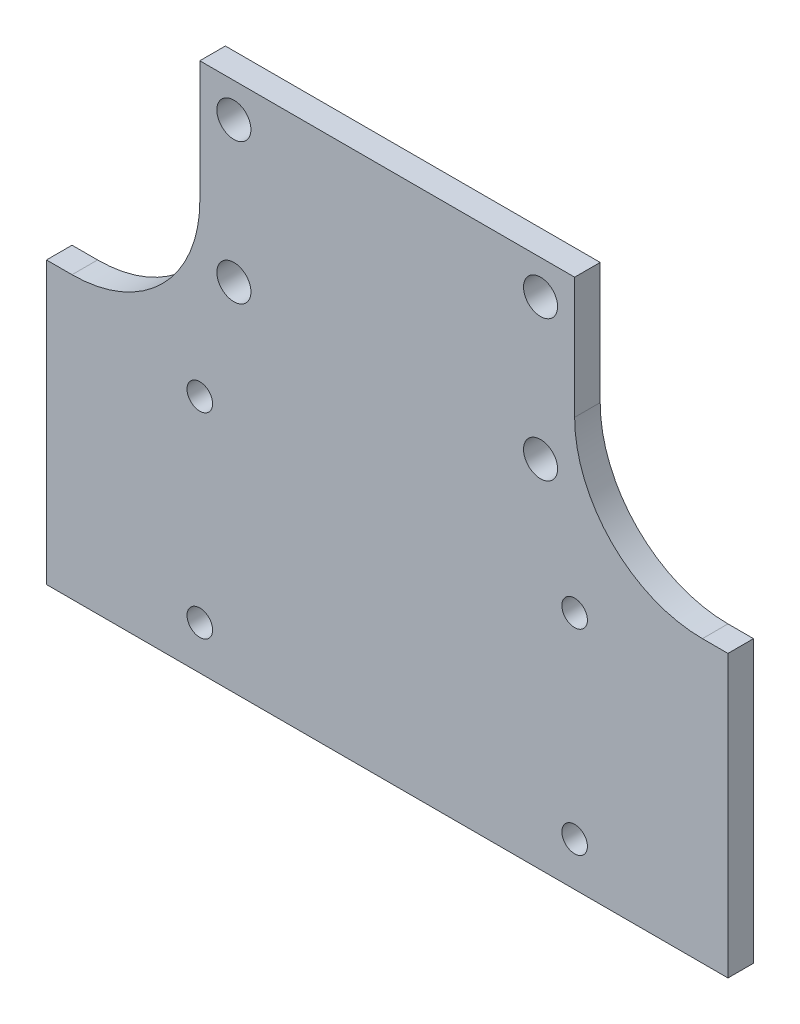
ISO-10303-21;
HEADER;
FILE_DESCRIPTION(('STEP AP214'),'2;1');
FILE_NAME('part.step','',(''),(''),'','','');
FILE_SCHEMA(('AUTOMOTIVE_DESIGN { 1 0 10303 214 1 1 1 1 }'));
ENDSEC;
DATA;
#1=APPLICATION_CONTEXT('core data for automotive mechanical design processes');
#2=APPLICATION_PROTOCOL_DEFINITION('international standard','automotive_design',2000,#1);
#3=PRODUCT_CONTEXT('',#1,'mechanical');
#4=PRODUCT('Part','Part','',(#3));
#5=PRODUCT_RELATED_PRODUCT_CATEGORY('part','',(#4));
#6=PRODUCT_DEFINITION_FORMATION('','',#4);
#7=PRODUCT_DEFINITION_CONTEXT('part definition',#1,'design');
#8=PRODUCT_DEFINITION('design','',#6,#7);
#9=PRODUCT_DEFINITION_SHAPE('','',#8);
#10=(LENGTH_UNIT() NAMED_UNIT(*) SI_UNIT(.MILLI.,.METRE.));
#11=(NAMED_UNIT(*) PLANE_ANGLE_UNIT() SI_UNIT($,.RADIAN.));
#12=(NAMED_UNIT(*) SI_UNIT($,.STERADIAN.) SOLID_ANGLE_UNIT());
#13=UNCERTAINTY_MEASURE_WITH_UNIT(LENGTH_MEASURE(1.E-05),#10,'distance_accuracy_value','');
#14=(GEOMETRIC_REPRESENTATION_CONTEXT(3) GLOBAL_UNCERTAINTY_ASSIGNED_CONTEXT((#13)) GLOBAL_UNIT_ASSIGNED_CONTEXT((#10,
#11,#12)) REPRESENTATION_CONTEXT('',''));
#15=CARTESIAN_POINT('',(0.,0.,0.));
#16=DIRECTION('',(0.,0.,1.));
#17=DIRECTION('',(1.,0.,0.));
#18=AXIS2_PLACEMENT_3D('',#15,#16,#17);
#19=CARTESIAN_POINT('',(40.,0.,3.));
#20=DIRECTION('',(-1.,0.,0.));
#21=DIRECTION('',(0.,0.,1.));
#22=AXIS2_PLACEMENT_3D('',#19,#20,#21);
#23=PLANE('',#22);
#24=DIRECTION('',(0.,1.,0.));
#25=VECTOR('',#24,1.);
#26=CARTESIAN_POINT('',(40.,0.,0.));
#27=LINE('',#26,#25);
#28=CARTESIAN_POINT('',(40.,0.,0.));
#29=VERTEX_POINT('',#28);
#30=CARTESIAN_POINT('',(40.,33.,0.));
#31=VERTEX_POINT('',#30);
#32=EDGE_CURVE('E145',#29,#31,#27,.T.);
#33=ORIENTED_EDGE('',*,*,#32,.T.);
#34=DIRECTION('',(0.,0.,-1.));
#35=VECTOR('',#34,1.);
#36=CARTESIAN_POINT('',(40.,33.,3.));
#37=LINE('',#36,#35);
#38=CARTESIAN_POINT('',(40.,33.,3.));
#39=VERTEX_POINT('',#38);
#40=EDGE_CURVE('E124',#39,#31,#37,.T.);
#41=ORIENTED_EDGE('',*,*,#40,.F.);
#42=DIRECTION('',(0.,1.,0.));
#43=VECTOR('',#42,1.);
#44=CARTESIAN_POINT('',(40.,0.,3.));
#45=LINE('',#44,#43);
#46=CARTESIAN_POINT('',(40.,0.,3.));
#47=VERTEX_POINT('',#46);
#48=EDGE_CURVE('E132',#47,#39,#45,.T.);
#49=ORIENTED_EDGE('',*,*,#48,.F.);
#50=DIRECTION('',(0.,0.,-1.));
#51=VECTOR('',#50,1.);
#52=CARTESIAN_POINT('',(40.,0.,3.));
#53=LINE('',#52,#51);
#54=EDGE_CURVE('E212',#47,#29,#53,.T.);
#55=ORIENTED_EDGE('',*,*,#54,.T.);
#56=EDGE_LOOP('',(#33,#41,#49,#55));
#57=FACE_BOUND('',#56,.T.);
#58=ADVANCED_FACE('F41',(#57),#23,.F.);
#59=CARTESIAN_POINT('',(40.,33.,3.));
#60=DIRECTION('',(0.,-1.,0.));
#61=DIRECTION('',(0.,0.,-1.));
#62=AXIS2_PLACEMENT_3D('',#59,#60,#61);
#63=PLANE('',#62);
#64=DIRECTION('',(-1.,0.,0.));
#65=VECTOR('',#64,1.);
#66=CARTESIAN_POINT('',(40.,33.,0.));
#67=LINE('',#66,#65);
#68=CARTESIAN_POINT('',(37.,33.,0.));
#69=VERTEX_POINT('',#68);
#70=EDGE_CURVE('E186',#31,#69,#67,.T.);
#71=ORIENTED_EDGE('',*,*,#70,.T.);
#72=DIRECTION('',(0.,0.,-1.));
#73=VECTOR('',#72,1.);
#74=CARTESIAN_POINT('',(37.,33.,3.));
#75=LINE('',#74,#73);
#76=CARTESIAN_POINT('',(37.,33.,3.));
#77=VERTEX_POINT('',#76);
#78=EDGE_CURVE('E127',#69,#77,#75,.F.);
#79=ORIENTED_EDGE('',*,*,#78,.T.);
#80=DIRECTION('',(-1.,0.,0.));
#81=VECTOR('',#80,1.);
#82=CARTESIAN_POINT('',(40.,33.,3.));
#83=LINE('',#82,#81);
#84=EDGE_CURVE('E119',#39,#77,#83,.T.);
#85=ORIENTED_EDGE('',*,*,#84,.F.);
#86=ORIENTED_EDGE('',*,*,#40,.T.);
#87=EDGE_LOOP('',(#71,#79,#85,#86));
#88=FACE_BOUND('',#87,.T.);
#89=ADVANCED_FACE('F122',(#88),#63,.F.);
#90=CARTESIAN_POINT('',(22.,33.,3.));
#91=DIRECTION('',(-1.,0.,0.));
#92=DIRECTION('',(0.,0.,1.));
#93=AXIS2_PLACEMENT_3D('',#90,#91,#92);
#94=PLANE('',#93);
#95=DIRECTION('',(0.,1.,0.));
#96=VECTOR('',#95,1.);
#97=CARTESIAN_POINT('',(22.,33.,3.));
#98=LINE('',#97,#96);
#99=CARTESIAN_POINT('',(22.,48.,3.));
#100=VERTEX_POINT('',#99);
#101=CARTESIAN_POINT('',(22.,62.25,3.));
#102=VERTEX_POINT('',#101);
#103=EDGE_CURVE('E131',#100,#102,#98,.T.);
#104=ORIENTED_EDGE('',*,*,#103,.F.);
#105=DIRECTION('',(0.,0.,-1.));
#106=VECTOR('',#105,1.);
#107=CARTESIAN_POINT('',(22.,48.,0.));
#108=LINE('',#107,#106);
#109=CARTESIAN_POINT('',(22.,48.,0.));
#110=VERTEX_POINT('',#109);
#111=EDGE_CURVE('E147',#100,#110,#108,.T.);
#112=ORIENTED_EDGE('',*,*,#111,.T.);
#113=DIRECTION('',(0.,1.,0.));
#114=VECTOR('',#113,1.);
#115=CARTESIAN_POINT('',(22.,33.,0.));
#116=LINE('',#115,#114);
#117=CARTESIAN_POINT('',(22.,62.25,0.));
#118=VERTEX_POINT('',#117);
#119=EDGE_CURVE('E188',#110,#118,#116,.T.);
#120=ORIENTED_EDGE('',*,*,#119,.T.);
#121=DIRECTION('',(0.,0.,-1.));
#122=VECTOR('',#121,1.);
#123=CARTESIAN_POINT('',(22.,62.25,3.));
#124=LINE('',#123,#122);
#125=EDGE_CURVE('E148',#102,#118,#124,.T.);
#126=ORIENTED_EDGE('',*,*,#125,.F.);
#127=EDGE_LOOP('',(#104,#112,#120,#126));
#128=FACE_BOUND('',#127,.T.);
#129=ADVANCED_FACE('F178',(#128),#94,.F.);
#130=CARTESIAN_POINT('',(-22.,62.25,3.));
#131=DIRECTION('',(0.,-1.,0.));
#132=DIRECTION('',(0.,0.,-1.));
#133=AXIS2_PLACEMENT_3D('',#130,#131,#132);
#134=PLANE('',#133);
#135=DIRECTION('',(-1.,0.,0.));
#136=VECTOR('',#135,1.);
#137=CARTESIAN_POINT('',(-22.,62.25,0.));
#138=LINE('',#137,#136);
#139=CARTESIAN_POINT('',(-22.,62.25,0.));
#140=VERTEX_POINT('',#139);
#141=EDGE_CURVE('E193',#118,#140,#138,.T.);
#142=ORIENTED_EDGE('',*,*,#141,.T.);
#143=DIRECTION('',(0.,0.,-1.));
#144=VECTOR('',#143,1.);
#145=CARTESIAN_POINT('',(-22.,62.25,3.));
#146=LINE('',#145,#144);
#147=CARTESIAN_POINT('',(-22.,62.25,3.));
#148=VERTEX_POINT('',#147);
#149=EDGE_CURVE('E155',#148,#140,#146,.T.);
#150=ORIENTED_EDGE('',*,*,#149,.F.);
#151=DIRECTION('',(-1.,0.,0.));
#152=VECTOR('',#151,1.);
#153=CARTESIAN_POINT('',(-22.,62.25,3.));
#154=LINE('',#153,#152);
#155=EDGE_CURVE('E182',#102,#148,#154,.T.);
#156=ORIENTED_EDGE('',*,*,#155,.F.);
#157=ORIENTED_EDGE('',*,*,#125,.T.);
#158=EDGE_LOOP('',(#142,#150,#156,#157));
#159=FACE_BOUND('',#158,.T.);
#160=ADVANCED_FACE('F228',(#159),#134,.F.);
#161=CARTESIAN_POINT('',(-22.,33.,3.));
#162=DIRECTION('',(1.,0.,0.));
#163=DIRECTION('',(0.,0.,-1.));
#164=AXIS2_PLACEMENT_3D('',#161,#162,#163);
#165=PLANE('',#164);
#166=DIRECTION('',(0.,-1.,0.));
#167=VECTOR('',#166,1.);
#168=CARTESIAN_POINT('',(-22.,33.,0.));
#169=LINE('',#168,#167);
#170=CARTESIAN_POINT('',(-22.,48.,0.));
#171=VERTEX_POINT('',#170);
#172=EDGE_CURVE('E201',#140,#171,#169,.T.);
#173=ORIENTED_EDGE('',*,*,#172,.T.);
#174=DIRECTION('',(0.,0.,-1.));
#175=VECTOR('',#174,1.);
#176=CARTESIAN_POINT('',(-22.,48.,3.));
#177=LINE('',#176,#175);
#178=CARTESIAN_POINT('',(-22.,48.,3.));
#179=VERTEX_POINT('',#178);
#180=EDGE_CURVE('E57',#171,#179,#177,.F.);
#181=ORIENTED_EDGE('',*,*,#180,.T.);
#182=DIRECTION('',(0.,-1.,0.));
#183=VECTOR('',#182,1.);
#184=CARTESIAN_POINT('',(-22.,33.,3.));
#185=LINE('',#184,#183);
#186=EDGE_CURVE('E226',#148,#179,#185,.T.);
#187=ORIENTED_EDGE('',*,*,#186,.F.);
#188=ORIENTED_EDGE('',*,*,#149,.T.);
#189=EDGE_LOOP('',(#173,#181,#187,#188));
#190=FACE_BOUND('',#189,.T.);
#191=ADVANCED_FACE('F225',(#190),#165,.F.);
#192=CARTESIAN_POINT('',(-40.,33.,3.));
#193=DIRECTION('',(0.,-1.,0.));
#194=DIRECTION('',(0.,0.,-1.));
#195=AXIS2_PLACEMENT_3D('',#192,#193,#194);
#196=PLANE('',#195);
#197=DIRECTION('',(-1.,0.,0.));
#198=VECTOR('',#197,1.);
#199=CARTESIAN_POINT('',(-40.,33.,3.));
#200=LINE('',#199,#198);
#201=CARTESIAN_POINT('',(-37.,33.,3.));
#202=VERTEX_POINT('',#201);
#203=CARTESIAN_POINT('',(-40.,33.,3.));
#204=VERTEX_POINT('',#203);
#205=EDGE_CURVE('E232',#202,#204,#200,.T.);
#206=ORIENTED_EDGE('',*,*,#205,.F.);
#207=DIRECTION('',(0.,0.,-1.));
#208=VECTOR('',#207,1.);
#209=CARTESIAN_POINT('',(-37.,33.,0.));
#210=LINE('',#209,#208);
#211=CARTESIAN_POINT('',(-37.,33.,0.));
#212=VERTEX_POINT('',#211);
#213=EDGE_CURVE('E161',#202,#212,#210,.T.);
#214=ORIENTED_EDGE('',*,*,#213,.T.);
#215=DIRECTION('',(-1.,0.,0.));
#216=VECTOR('',#215,1.);
#217=CARTESIAN_POINT('',(-40.,33.,0.));
#218=LINE('',#217,#216);
#219=CARTESIAN_POINT('',(-40.,33.,0.));
#220=VERTEX_POINT('',#219);
#221=EDGE_CURVE('E204',#212,#220,#218,.T.);
#222=ORIENTED_EDGE('',*,*,#221,.T.);
#223=DIRECTION('',(0.,0.,-1.));
#224=VECTOR('',#223,1.);
#225=CARTESIAN_POINT('',(-40.,33.,3.));
#226=LINE('',#225,#224);
#227=EDGE_CURVE('E219',#204,#220,#226,.T.);
#228=ORIENTED_EDGE('',*,*,#227,.F.);
#229=EDGE_LOOP('',(#206,#214,#222,#228));
#230=FACE_BOUND('',#229,.T.);
#231=ADVANCED_FACE('F251',(#230),#196,.F.);
#232=CARTESIAN_POINT('',(-40.,0.,3.));
#233=DIRECTION('',(1.,0.,0.));
#234=DIRECTION('',(0.,0.,-1.));
#235=AXIS2_PLACEMENT_3D('',#232,#233,#234);
#236=PLANE('',#235);
#237=DIRECTION('',(0.,-1.,0.));
#238=VECTOR('',#237,1.);
#239=CARTESIAN_POINT('',(-40.,0.,0.));
#240=LINE('',#239,#238);
#241=CARTESIAN_POINT('',(-40.,0.,0.));
#242=VERTEX_POINT('',#241);
#243=EDGE_CURVE('E207',#220,#242,#240,.T.);
#244=ORIENTED_EDGE('',*,*,#243,.T.);
#245=DIRECTION('',(0.,0.,-1.));
#246=VECTOR('',#245,1.);
#247=CARTESIAN_POINT('',(-40.,0.,3.));
#248=LINE('',#247,#246);
#249=CARTESIAN_POINT('',(-40.,0.,3.));
#250=VERTEX_POINT('',#249);
#251=EDGE_CURVE('E215',#250,#242,#248,.T.);
#252=ORIENTED_EDGE('',*,*,#251,.F.);
#253=DIRECTION('',(0.,-1.,0.));
#254=VECTOR('',#253,1.);
#255=CARTESIAN_POINT('',(-40.,0.,3.));
#256=LINE('',#255,#254);
#257=EDGE_CURVE('E237',#204,#250,#256,.T.);
#258=ORIENTED_EDGE('',*,*,#257,.F.);
#259=ORIENTED_EDGE('',*,*,#227,.T.);
#260=EDGE_LOOP('',(#244,#252,#258,#259));
#261=FACE_BOUND('',#260,.T.);
#262=ADVANCED_FACE('F245',(#261),#236,.F.);
#263=CARTESIAN_POINT('',(40.,0.,3.));
#264=DIRECTION('',(0.,1.,0.));
#265=DIRECTION('',(0.,0.,1.));
#266=AXIS2_PLACEMENT_3D('',#263,#264,#265);
#267=PLANE('',#266);
#268=DIRECTION('',(1.,0.,0.));
#269=VECTOR('',#268,1.);
#270=CARTESIAN_POINT('',(40.,0.,0.));
#271=LINE('',#270,#269);
#272=EDGE_CURVE('E142',#242,#29,#271,.T.);
#273=ORIENTED_EDGE('',*,*,#272,.T.);
#274=ORIENTED_EDGE('',*,*,#54,.F.);
#275=DIRECTION('',(1.,0.,0.));
#276=VECTOR('',#275,1.);
#277=CARTESIAN_POINT('',(40.,0.,3.));
#278=LINE('',#277,#276);
#279=EDGE_CURVE('E137',#250,#47,#278,.T.);
#280=ORIENTED_EDGE('',*,*,#279,.F.);
#281=ORIENTED_EDGE('',*,*,#251,.T.);
#282=EDGE_LOOP('',(#273,#274,#280,#281));
#283=FACE_BOUND('',#282,.T.);
#284=ADVANCED_FACE('F249',(#283),#267,.F.);
#285=CARTESIAN_POINT('',(0.,0.,3.));
#286=DIRECTION('',(0.,0.,1.));
#287=DIRECTION('',(1.,0.,0.));
#288=AXIS2_PLACEMENT_3D('',#285,#286,#287);
#289=PLANE('',#288);
#290=CARTESIAN_POINT('',(-22.,5.12500000000001,3.));
#291=DIRECTION('',(0.,0.,1.));
#292=DIRECTION('',(1.,0.,0.));
#293=AXIS2_PLACEMENT_3D('',#290,#291,#292);
#294=CIRCLE('',#293,1.5);
#295=CARTESIAN_POINT('',(-20.5,5.12500000000001,3.));
#296=VERTEX_POINT('',#295);
#297=EDGE_CURVE('E343',#296,#296,#294,.T.);
#298=ORIENTED_EDGE('',*,*,#297,.F.);
#299=EDGE_LOOP('',(#298));
#300=FACE_BOUND('',#299,.T.);
#301=CARTESIAN_POINT('',(22.,5.12500000000001,3.));
#302=DIRECTION('',(0.,0.,1.));
#303=DIRECTION('',(1.,0.,0.));
#304=AXIS2_PLACEMENT_3D('',#301,#302,#303);
#305=CIRCLE('',#304,1.5);
#306=CARTESIAN_POINT('',(23.5,5.12500000000001,3.));
#307=VERTEX_POINT('',#306);
#308=EDGE_CURVE('E333',#307,#307,#305,.T.);
#309=ORIENTED_EDGE('',*,*,#308,.F.);
#310=EDGE_LOOP('',(#309));
#311=FACE_BOUND('',#310,.T.);
#312=CARTESIAN_POINT('',(22.,28.125,3.));
#313=DIRECTION('',(0.,0.,1.));
#314=DIRECTION('',(1.,0.,0.));
#315=AXIS2_PLACEMENT_3D('',#312,#313,#314);
#316=CIRCLE('',#315,1.5);
#317=CARTESIAN_POINT('',(23.5,28.125,3.));
#318=VERTEX_POINT('',#317);
#319=EDGE_CURVE('E323',#318,#318,#316,.T.);
#320=ORIENTED_EDGE('',*,*,#319,.F.);
#321=EDGE_LOOP('',(#320));
#322=FACE_BOUND('',#321,.T.);
#323=CARTESIAN_POINT('',(-22.,28.125,3.));
#324=DIRECTION('',(0.,0.,1.));
#325=DIRECTION('',(1.,0.,0.));
#326=AXIS2_PLACEMENT_3D('',#323,#324,#325);
#327=CIRCLE('',#326,1.5);
#328=CARTESIAN_POINT('',(-20.5,28.125,3.));
#329=VERTEX_POINT('',#328);
#330=EDGE_CURVE('E330',#329,#329,#327,.T.);
#331=ORIENTED_EDGE('',*,*,#330,.F.);
#332=EDGE_LOOP('',(#331));
#333=FACE_BOUND('',#332,.T.);
#334=CARTESIAN_POINT('',(18.,58.25,3.));
#335=DIRECTION('',(0.,0.,1.));
#336=DIRECTION('',(1.,0.,0.));
#337=AXIS2_PLACEMENT_3D('',#334,#335,#336);
#338=CIRCLE('',#337,2.);
#339=CARTESIAN_POINT('',(20.,58.25,3.));
#340=VERTEX_POINT('',#339);
#341=EDGE_CURVE('E351',#340,#340,#338,.T.);
#342=ORIENTED_EDGE('',*,*,#341,.F.);
#343=EDGE_LOOP('',(#342));
#344=FACE_BOUND('',#343,.T.);
#345=CARTESIAN_POINT('',(18.,41.75,3.));
#346=DIRECTION('',(0.,0.,1.));
#347=DIRECTION('',(1.,0.,0.));
#348=AXIS2_PLACEMENT_3D('',#345,#346,#347);
#349=CIRCLE('',#348,2.00000000000001);
#350=CARTESIAN_POINT('',(20.,41.75,3.));
#351=VERTEX_POINT('',#350);
#352=EDGE_CURVE('E368',#351,#351,#349,.T.);
#353=ORIENTED_EDGE('',*,*,#352,.F.);
#354=EDGE_LOOP('',(#353));
#355=FACE_BOUND('',#354,.T.);
#356=CARTESIAN_POINT('',(-18.,41.75,3.));
#357=DIRECTION('',(0.,0.,1.));
#358=DIRECTION('',(1.,0.,0.));
#359=AXIS2_PLACEMENT_3D('',#356,#357,#358);
#360=CIRCLE('',#359,2.);
#361=CARTESIAN_POINT('',(-16.,41.75,3.));
#362=VERTEX_POINT('',#361);
#363=EDGE_CURVE('E360',#362,#362,#360,.T.);
#364=ORIENTED_EDGE('',*,*,#363,.F.);
#365=EDGE_LOOP('',(#364));
#366=FACE_BOUND('',#365,.T.);
#367=CARTESIAN_POINT('',(-18.,58.25,3.));
#368=DIRECTION('',(0.,0.,1.));
#369=DIRECTION('',(1.,0.,0.));
#370=AXIS2_PLACEMENT_3D('',#367,#368,#369);
#371=CIRCLE('',#370,2.);
#372=CARTESIAN_POINT('',(-16.,58.25,3.));
#373=VERTEX_POINT('',#372);
#374=EDGE_CURVE('E359',#373,#373,#371,.T.);
#375=ORIENTED_EDGE('',*,*,#374,.F.);
#376=EDGE_LOOP('',(#375));
#377=FACE_BOUND('',#376,.T.);
#378=ORIENTED_EDGE('',*,*,#48,.T.);
#379=ORIENTED_EDGE('',*,*,#84,.T.);
#380=CARTESIAN_POINT('',(37.,48.,3.));
#381=DIRECTION('',(0.,0.,1.));
#382=DIRECTION('',(1.,0.,0.));
#383=AXIS2_PLACEMENT_3D('',#380,#381,#382);
#384=CIRCLE('',#383,15.);
#385=EDGE_CURVE('E170',#77,#100,#384,.F.);
#386=ORIENTED_EDGE('',*,*,#385,.T.);
#387=ORIENTED_EDGE('',*,*,#103,.T.);
#388=ORIENTED_EDGE('',*,*,#155,.T.);
#389=ORIENTED_EDGE('',*,*,#186,.T.);
#390=CARTESIAN_POINT('',(-37.,48.,3.));
#391=DIRECTION('',(0.,0.,1.));
#392=DIRECTION('',(1.,0.,0.));
#393=AXIS2_PLACEMENT_3D('',#390,#391,#392);
#394=CIRCLE('',#393,15.);
#395=EDGE_CURVE('E11',#179,#202,#394,.F.);
#396=ORIENTED_EDGE('',*,*,#395,.T.);
#397=ORIENTED_EDGE('',*,*,#205,.T.);
#398=ORIENTED_EDGE('',*,*,#257,.T.);
#399=ORIENTED_EDGE('',*,*,#279,.T.);
#400=EDGE_LOOP('',(#378,#379,#386,#387,#388,#389,#396,#397,#398,#399));
#401=FACE_BOUND('',#400,.T.);
#402=ADVANCED_FACE('F135',(#300,#311,#322,#333,#344,#355,#366,#377,#401),#289,.T.);
#403=CARTESIAN_POINT('',(0.,0.,0.));
#404=DIRECTION('',(0.,0.,1.));
#405=DIRECTION('',(1.,0.,0.));
#406=AXIS2_PLACEMENT_3D('',#403,#404,#405);
#407=PLANE('',#406);
#408=CARTESIAN_POINT('',(-22.,5.12500000000001,0.));
#409=DIRECTION('',(0.,0.,1.));
#410=DIRECTION('',(1.,0.,0.));
#411=AXIS2_PLACEMENT_3D('',#408,#409,#410);
#412=CIRCLE('',#411,1.5);
#413=CARTESIAN_POINT('',(-20.5,5.12500000000001,0.));
#414=VERTEX_POINT('',#413);
#415=EDGE_CURVE('E339',#414,#414,#412,.T.);
#416=ORIENTED_EDGE('',*,*,#415,.T.);
#417=EDGE_LOOP('',(#416));
#418=FACE_BOUND('',#417,.T.);
#419=CARTESIAN_POINT('',(22.,5.12500000000001,0.));
#420=DIRECTION('',(0.,0.,1.));
#421=DIRECTION('',(1.,0.,0.));
#422=AXIS2_PLACEMENT_3D('',#419,#420,#421);
#423=CIRCLE('',#422,1.5);
#424=CARTESIAN_POINT('',(23.5,5.12500000000001,0.));
#425=VERTEX_POINT('',#424);
#426=EDGE_CURVE('E326',#425,#425,#423,.T.);
#427=ORIENTED_EDGE('',*,*,#426,.T.);
#428=EDGE_LOOP('',(#427));
#429=FACE_BOUND('',#428,.T.);
#430=CARTESIAN_POINT('',(22.,28.125,0.));
#431=DIRECTION('',(0.,0.,1.));
#432=DIRECTION('',(1.,0.,0.));
#433=AXIS2_PLACEMENT_3D('',#430,#431,#432);
#434=CIRCLE('',#433,1.5);
#435=CARTESIAN_POINT('',(23.5,28.125,0.));
#436=VERTEX_POINT('',#435);
#437=EDGE_CURVE('E320',#436,#436,#434,.T.);
#438=ORIENTED_EDGE('',*,*,#437,.T.);
#439=EDGE_LOOP('',(#438));
#440=FACE_BOUND('',#439,.T.);
#441=CARTESIAN_POINT('',(-22.,28.125,0.));
#442=DIRECTION('',(0.,0.,1.));
#443=DIRECTION('',(1.,0.,0.));
#444=AXIS2_PLACEMENT_3D('',#441,#442,#443);
#445=CIRCLE('',#444,1.5);
#446=CARTESIAN_POINT('',(-20.5,28.125,0.));
#447=VERTEX_POINT('',#446);
#448=EDGE_CURVE('E347',#447,#447,#445,.T.);
#449=ORIENTED_EDGE('',*,*,#448,.T.);
#450=EDGE_LOOP('',(#449));
#451=FACE_BOUND('',#450,.T.);
#452=CARTESIAN_POINT('',(18.,58.25,0.));
#453=DIRECTION('',(0.,0.,1.));
#454=DIRECTION('',(1.,0.,0.));
#455=AXIS2_PLACEMENT_3D('',#452,#453,#454);
#456=CIRCLE('',#455,2.);
#457=CARTESIAN_POINT('',(20.,58.25,0.));
#458=VERTEX_POINT('',#457);
#459=EDGE_CURVE('E372',#458,#458,#456,.T.);
#460=ORIENTED_EDGE('',*,*,#459,.T.);
#461=EDGE_LOOP('',(#460));
#462=FACE_BOUND('',#461,.T.);
#463=CARTESIAN_POINT('',(18.,41.75,0.));
#464=DIRECTION('',(0.,0.,1.));
#465=DIRECTION('',(1.,0.,0.));
#466=AXIS2_PLACEMENT_3D('',#463,#464,#465);
#467=CIRCLE('',#466,2.00000000000001);
#468=CARTESIAN_POINT('',(20.,41.75,0.));
#469=VERTEX_POINT('',#468);
#470=EDGE_CURVE('E364',#469,#469,#467,.T.);
#471=ORIENTED_EDGE('',*,*,#470,.T.);
#472=EDGE_LOOP('',(#471));
#473=FACE_BOUND('',#472,.T.);
#474=CARTESIAN_POINT('',(-18.,41.75,0.));
#475=DIRECTION('',(0.,0.,1.));
#476=DIRECTION('',(1.,0.,0.));
#477=AXIS2_PLACEMENT_3D('',#474,#475,#476);
#478=CIRCLE('',#477,2.);
#479=CARTESIAN_POINT('',(-16.,41.75,0.));
#480=VERTEX_POINT('',#479);
#481=EDGE_CURVE('E355',#480,#480,#478,.T.);
#482=ORIENTED_EDGE('',*,*,#481,.T.);
#483=EDGE_LOOP('',(#482));
#484=FACE_BOUND('',#483,.T.);
#485=CARTESIAN_POINT('',(-18.,58.25,0.));
#486=DIRECTION('',(0.,0.,1.));
#487=DIRECTION('',(1.,0.,0.));
#488=AXIS2_PLACEMENT_3D('',#485,#486,#487);
#489=CIRCLE('',#488,2.);
#490=CARTESIAN_POINT('',(-16.,58.25,0.));
#491=VERTEX_POINT('',#490);
#492=EDGE_CURVE('E195',#491,#491,#489,.T.);
#493=ORIENTED_EDGE('',*,*,#492,.T.);
#494=EDGE_LOOP('',(#493));
#495=FACE_BOUND('',#494,.T.);
#496=ORIENTED_EDGE('',*,*,#32,.F.);
#497=ORIENTED_EDGE('',*,*,#272,.F.);
#498=ORIENTED_EDGE('',*,*,#243,.F.);
#499=ORIENTED_EDGE('',*,*,#221,.F.);
#500=CARTESIAN_POINT('',(-37.,48.,0.));
#501=DIRECTION('',(0.,0.,1.));
#502=DIRECTION('',(1.,0.,0.));
#503=AXIS2_PLACEMENT_3D('',#500,#501,#502);
#504=CIRCLE('',#503,15.);
#505=EDGE_CURVE('E50',#212,#171,#504,.T.);
#506=ORIENTED_EDGE('',*,*,#505,.T.);
#507=ORIENTED_EDGE('',*,*,#172,.F.);
#508=ORIENTED_EDGE('',*,*,#141,.F.);
#509=ORIENTED_EDGE('',*,*,#119,.F.);
#510=CARTESIAN_POINT('',(37.,48.,0.));
#511=DIRECTION('',(0.,0.,1.));
#512=DIRECTION('',(1.,0.,0.));
#513=AXIS2_PLACEMENT_3D('',#510,#511,#512);
#514=CIRCLE('',#513,15.);
#515=EDGE_CURVE('E167',#110,#69,#514,.T.);
#516=ORIENTED_EDGE('',*,*,#515,.T.);
#517=ORIENTED_EDGE('',*,*,#70,.F.);
#518=EDGE_LOOP('',(#496,#497,#498,#499,#506,#507,#508,#509,#516,#517));
#519=FACE_BOUND('',#518,.T.);
#520=ADVANCED_FACE('F185',(#418,#429,#440,#451,#462,#473,#484,#495,#519),#407,.F.);
#521=CARTESIAN_POINT('',(-18.,58.25,0.));
#522=DIRECTION('',(0.,0.,1.));
#523=DIRECTION('',(1.,0.,0.));
#524=AXIS2_PLACEMENT_3D('',#521,#522,#523);
#525=CYLINDRICAL_SURFACE('',#524,2.);
#526=ORIENTED_EDGE('',*,*,#492,.F.);
#527=EDGE_LOOP('',(#526));
#528=FACE_BOUND('',#527,.T.);
#529=ORIENTED_EDGE('',*,*,#374,.T.);
#530=EDGE_LOOP('',(#529));
#531=FACE_BOUND('',#530,.T.);
#532=ADVANCED_FACE('F281',(#528,#531),#525,.F.);
#533=CARTESIAN_POINT('',(-18.,41.75,0.));
#534=DIRECTION('',(0.,0.,1.));
#535=DIRECTION('',(1.,0.,0.));
#536=AXIS2_PLACEMENT_3D('',#533,#534,#535);
#537=CYLINDRICAL_SURFACE('',#536,2.);
#538=ORIENTED_EDGE('',*,*,#481,.F.);
#539=EDGE_LOOP('',(#538));
#540=FACE_BOUND('',#539,.T.);
#541=ORIENTED_EDGE('',*,*,#363,.T.);
#542=EDGE_LOOP('',(#541));
#543=FACE_BOUND('',#542,.T.);
#544=ADVANCED_FACE('F288',(#540,#543),#537,.F.);
#545=CARTESIAN_POINT('',(18.,41.75,0.));
#546=DIRECTION('',(0.,0.,1.));
#547=DIRECTION('',(1.,0.,0.));
#548=AXIS2_PLACEMENT_3D('',#545,#546,#547);
#549=CYLINDRICAL_SURFACE('',#548,2.00000000000001);
#550=ORIENTED_EDGE('',*,*,#470,.F.);
#551=EDGE_LOOP('',(#550));
#552=FACE_BOUND('',#551,.T.);
#553=ORIENTED_EDGE('',*,*,#352,.T.);
#554=EDGE_LOOP('',(#553));
#555=FACE_BOUND('',#554,.T.);
#556=ADVANCED_FACE('F294',(#552,#555),#549,.F.);
#557=CARTESIAN_POINT('',(18.,58.25,0.));
#558=DIRECTION('',(0.,0.,1.));
#559=DIRECTION('',(1.,0.,0.));
#560=AXIS2_PLACEMENT_3D('',#557,#558,#559);
#561=CYLINDRICAL_SURFACE('',#560,2.);
#562=ORIENTED_EDGE('',*,*,#459,.F.);
#563=EDGE_LOOP('',(#562));
#564=FACE_BOUND('',#563,.T.);
#565=ORIENTED_EDGE('',*,*,#341,.T.);
#566=EDGE_LOOP('',(#565));
#567=FACE_BOUND('',#566,.T.);
#568=ADVANCED_FACE('F290',(#564,#567),#561,.F.);
#569=CARTESIAN_POINT('',(-22.,28.125,0.));
#570=DIRECTION('',(0.,0.,1.));
#571=DIRECTION('',(1.,0.,0.));
#572=AXIS2_PLACEMENT_3D('',#569,#570,#571);
#573=CYLINDRICAL_SURFACE('',#572,1.5);
#574=ORIENTED_EDGE('',*,*,#448,.F.);
#575=EDGE_LOOP('',(#574));
#576=FACE_BOUND('',#575,.T.);
#577=ORIENTED_EDGE('',*,*,#330,.T.);
#578=EDGE_LOOP('',(#577));
#579=FACE_BOUND('',#578,.T.);
#580=ADVANCED_FACE('F293',(#576,#579),#573,.F.);
#581=CARTESIAN_POINT('',(22.,28.125,0.));
#582=DIRECTION('',(0.,0.,1.));
#583=DIRECTION('',(1.,0.,0.));
#584=AXIS2_PLACEMENT_3D('',#581,#582,#583);
#585=CYLINDRICAL_SURFACE('',#584,1.5);
#586=ORIENTED_EDGE('',*,*,#437,.F.);
#587=EDGE_LOOP('',(#586));
#588=FACE_BOUND('',#587,.T.);
#589=ORIENTED_EDGE('',*,*,#319,.T.);
#590=EDGE_LOOP('',(#589));
#591=FACE_BOUND('',#590,.T.);
#592=ADVANCED_FACE('F304',(#588,#591),#585,.F.);
#593=CARTESIAN_POINT('',(22.,5.12500000000001,0.));
#594=DIRECTION('',(0.,0.,1.));
#595=DIRECTION('',(1.,0.,0.));
#596=AXIS2_PLACEMENT_3D('',#593,#594,#595);
#597=CYLINDRICAL_SURFACE('',#596,1.5);
#598=ORIENTED_EDGE('',*,*,#426,.F.);
#599=EDGE_LOOP('',(#598));
#600=FACE_BOUND('',#599,.T.);
#601=ORIENTED_EDGE('',*,*,#308,.T.);
#602=EDGE_LOOP('',(#601));
#603=FACE_BOUND('',#602,.T.);
#604=ADVANCED_FACE('F308',(#600,#603),#597,.F.);
#605=CARTESIAN_POINT('',(-22.,5.12500000000001,0.));
#606=DIRECTION('',(0.,0.,1.));
#607=DIRECTION('',(1.,0.,0.));
#608=AXIS2_PLACEMENT_3D('',#605,#606,#607);
#609=CYLINDRICAL_SURFACE('',#608,1.5);
#610=ORIENTED_EDGE('',*,*,#415,.F.);
#611=EDGE_LOOP('',(#610));
#612=FACE_BOUND('',#611,.T.);
#613=ORIENTED_EDGE('',*,*,#297,.T.);
#614=EDGE_LOOP('',(#613));
#615=FACE_BOUND('',#614,.T.);
#616=ADVANCED_FACE('F259',(#612,#615),#609,.F.);
#617=CARTESIAN_POINT('',(37.,48.,3.));
#618=DIRECTION('',(0.,0.,1.));
#619=DIRECTION('',(1.,0.,0.));
#620=AXIS2_PLACEMENT_3D('',#617,#618,#619);
#621=CYLINDRICAL_SURFACE('',#620,15.);
#622=ORIENTED_EDGE('',*,*,#385,.F.);
#623=ORIENTED_EDGE('',*,*,#78,.F.);
#624=ORIENTED_EDGE('',*,*,#515,.F.);
#625=ORIENTED_EDGE('',*,*,#111,.F.);
#626=EDGE_LOOP('',(#622,#623,#624,#625));
#627=FACE_BOUND('',#626,.T.);
#628=ADVANCED_FACE('F184',(#627),#621,.F.);
#629=CARTESIAN_POINT('',(-37.,48.,3.));
#630=DIRECTION('',(0.,0.,1.));
#631=DIRECTION('',(1.,0.,0.));
#632=AXIS2_PLACEMENT_3D('',#629,#630,#631);
#633=CYLINDRICAL_SURFACE('',#632,15.);
#634=ORIENTED_EDGE('',*,*,#395,.F.);
#635=ORIENTED_EDGE('',*,*,#180,.F.);
#636=ORIENTED_EDGE('',*,*,#505,.F.);
#637=ORIENTED_EDGE('',*,*,#213,.F.);
#638=EDGE_LOOP('',(#634,#635,#636,#637));
#639=FACE_BOUND('',#638,.T.);
#640=ADVANCED_FACE('F43',(#639),#633,.F.);
#641=CLOSED_SHELL('',(#58,#89,#129,#160,#191,#231,#262,#284,#402,#520,#532,#544,#556,#568,#580,
#592,#604,#616,#628,#640));
#642=MANIFOLD_SOLID_BREP('B2',#641);
#643=ADVANCED_BREP_SHAPE_REPRESENTATION('',(#18,#642),#14);
#644=SHAPE_DEFINITION_REPRESENTATION(#9,#643);
ENDSEC;
END-ISO-10303-21;
